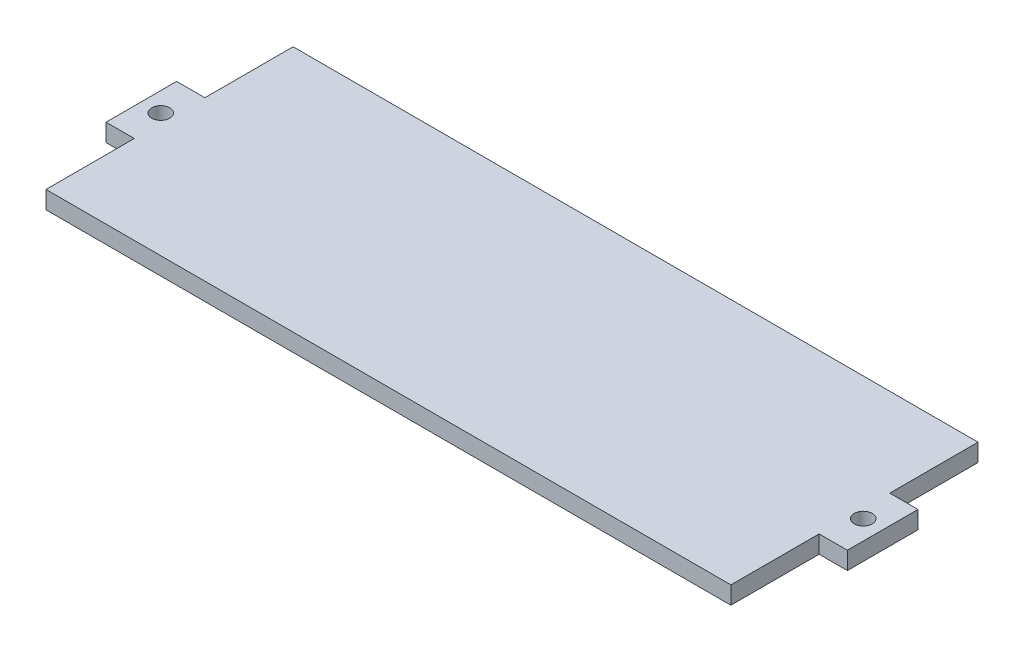
ISO-10303-21;
HEADER;
FILE_DESCRIPTION(('STEP AP214'),'2;1');
FILE_NAME('part.step','',(''),(''),'','','');
FILE_SCHEMA(('AUTOMOTIVE_DESIGN { 1 0 10303 214 1 1 1 1 }'));
ENDSEC;
DATA;
#1=APPLICATION_CONTEXT('core data for automotive mechanical design processes');
#2=APPLICATION_PROTOCOL_DEFINITION('international standard','automotive_design',2000,#1);
#3=PRODUCT_CONTEXT('',#1,'mechanical');
#4=PRODUCT('Part','Part','',(#3));
#5=PRODUCT_RELATED_PRODUCT_CATEGORY('part','',(#4));
#6=PRODUCT_DEFINITION_FORMATION('','',#4);
#7=PRODUCT_DEFINITION_CONTEXT('part definition',#1,'design');
#8=PRODUCT_DEFINITION('design','',#6,#7);
#9=PRODUCT_DEFINITION_SHAPE('','',#8);
#10=(LENGTH_UNIT() NAMED_UNIT(*) SI_UNIT(.MILLI.,.METRE.));
#11=(NAMED_UNIT(*) PLANE_ANGLE_UNIT() SI_UNIT($,.RADIAN.));
#12=(NAMED_UNIT(*) SI_UNIT($,.STERADIAN.) SOLID_ANGLE_UNIT());
#13=UNCERTAINTY_MEASURE_WITH_UNIT(LENGTH_MEASURE(1.E-05),#10,'distance_accuracy_value','');
#14=(GEOMETRIC_REPRESENTATION_CONTEXT(3) GLOBAL_UNCERTAINTY_ASSIGNED_CONTEXT((#13)) GLOBAL_UNIT_ASSIGNED_CONTEXT((#10,
#11,#12)) REPRESENTATION_CONTEXT('',''));
#15=CARTESIAN_POINT('',(0.,0.,0.));
#16=DIRECTION('',(0.,0.,1.));
#17=DIRECTION('',(1.,0.,0.));
#18=AXIS2_PLACEMENT_3D('',#15,#16,#17);
#19=CARTESIAN_POINT('',(0.,3.175,0.));
#20=DIRECTION('',(0.,1.,0.));
#21=DIRECTION('',(0.,0.,1.));
#22=AXIS2_PLACEMENT_3D('',#19,#20,#21);
#23=PLANE('',#22);
#24=CARTESIAN_POINT('',(-1.5875,3.175,-22.225));
#25=DIRECTION('',(0.,1.,0.));
#26=DIRECTION('',(0.,0.,1.));
#27=AXIS2_PLACEMENT_3D('',#24,#25,#26);
#28=CIRCLE('',#27,1.6256);
#29=CARTESIAN_POINT('',(-1.5875,3.175,-20.5994));
#30=VERTEX_POINT('',#29);
#31=EDGE_CURVE('E157',#30,#30,#28,.T.);
#32=ORIENTED_EDGE('',*,*,#31,.F.);
#33=EDGE_LOOP('',(#32));
#34=FACE_BOUND('',#33,.T.);
#35=DIRECTION('',(0.,0.,1.));
#36=VECTOR('',#35,1.);
#37=CARTESIAN_POINT('',(0.,3.175,0.));
#38=LINE('',#37,#36);
#39=CARTESIAN_POINT('',(0.,3.175,-15.875));
#40=VERTEX_POINT('',#39);
#41=CARTESIAN_POINT('',(0.,3.175,0.));
#42=VERTEX_POINT('',#41);
#43=EDGE_CURVE('E176',#40,#42,#38,.T.);
#44=ORIENTED_EDGE('',*,*,#43,.T.);
#45=DIRECTION('',(1.,0.,0.));
#46=VECTOR('',#45,1.);
#47=CARTESIAN_POINT('',(0.,3.175,0.));
#48=LINE('',#47,#46);
#49=CARTESIAN_POINT('',(123.19,3.175,0.));
#50=VERTEX_POINT('',#49);
#51=EDGE_CURVE('E104',#42,#50,#48,.T.);
#52=ORIENTED_EDGE('',*,*,#51,.T.);
#53=DIRECTION('',(0.,0.,-1.));
#54=VECTOR('',#53,1.);
#55=CARTESIAN_POINT('',(123.19,3.175,0.));
#56=LINE('',#55,#54);
#57=CARTESIAN_POINT('',(123.19,3.175,-15.875));
#58=VERTEX_POINT('',#57);
#59=EDGE_CURVE('E203',#50,#58,#56,.T.);
#60=ORIENTED_EDGE('',*,*,#59,.T.);
#61=DIRECTION('',(1.,0.,0.));
#62=VECTOR('',#61,1.);
#63=CARTESIAN_POINT('',(123.19,3.175,-15.875));
#64=LINE('',#63,#62);
#65=CARTESIAN_POINT('',(128.27,3.175,-15.875));
#66=VERTEX_POINT('',#65);
#67=EDGE_CURVE('E222',#58,#66,#64,.T.);
#68=ORIENTED_EDGE('',*,*,#67,.T.);
#69=DIRECTION('',(0.,0.,-1.));
#70=VECTOR('',#69,1.);
#71=CARTESIAN_POINT('',(128.27,3.175,-28.575));
#72=LINE('',#71,#70);
#73=CARTESIAN_POINT('',(128.27,3.175,-28.575));
#74=VERTEX_POINT('',#73);
#75=EDGE_CURVE('E219',#66,#74,#72,.T.);
#76=ORIENTED_EDGE('',*,*,#75,.T.);
#77=DIRECTION('',(-1.,0.,0.));
#78=VECTOR('',#77,1.);
#79=CARTESIAN_POINT('',(123.19,3.175,-28.575));
#80=LINE('',#79,#78);
#81=CARTESIAN_POINT('',(123.19,3.175,-28.575));
#82=VERTEX_POINT('',#81);
#83=EDGE_CURVE('E221',#74,#82,#80,.T.);
#84=ORIENTED_EDGE('',*,*,#83,.T.);
#85=DIRECTION('',(0.,0.,-1.));
#86=VECTOR('',#85,1.);
#87=CARTESIAN_POINT('',(123.19,3.175,-28.575));
#88=LINE('',#87,#86);
#89=CARTESIAN_POINT('',(123.19,3.175,-44.45));
#90=VERTEX_POINT('',#89);
#91=EDGE_CURVE('E224',#82,#90,#88,.T.);
#92=ORIENTED_EDGE('',*,*,#91,.T.);
#93=DIRECTION('',(-1.,0.,0.));
#94=VECTOR('',#93,1.);
#95=CARTESIAN_POINT('',(0.,3.175,-44.45));
#96=LINE('',#95,#94);
#97=CARTESIAN_POINT('',(0.,3.175,-44.45));
#98=VERTEX_POINT('',#97);
#99=EDGE_CURVE('E230',#90,#98,#96,.T.);
#100=ORIENTED_EDGE('',*,*,#99,.T.);
#101=DIRECTION('',(0.,0.,1.));
#102=VECTOR('',#101,1.);
#103=CARTESIAN_POINT('',(0.,3.175,-28.575));
#104=LINE('',#103,#102);
#105=CARTESIAN_POINT('',(0.,3.175,-28.575));
#106=VERTEX_POINT('',#105);
#107=EDGE_CURVE('E135',#98,#106,#104,.T.);
#108=ORIENTED_EDGE('',*,*,#107,.T.);
#109=DIRECTION('',(-1.,0.,0.));
#110=VECTOR('',#109,1.);
#111=CARTESIAN_POINT('',(0.,3.175,-28.575));
#112=LINE('',#111,#110);
#113=CARTESIAN_POINT('',(-5.08,3.175,-28.575));
#114=VERTEX_POINT('',#113);
#115=EDGE_CURVE('E129',#106,#114,#112,.T.);
#116=ORIENTED_EDGE('',*,*,#115,.T.);
#117=DIRECTION('',(0.,0.,1.));
#118=VECTOR('',#117,1.);
#119=CARTESIAN_POINT('',(-5.08,3.175,-28.575));
#120=LINE('',#119,#118);
#121=CARTESIAN_POINT('',(-5.08,3.175,-15.875));
#122=VERTEX_POINT('',#121);
#123=EDGE_CURVE('E133',#114,#122,#120,.T.);
#124=ORIENTED_EDGE('',*,*,#123,.T.);
#125=DIRECTION('',(1.,0.,0.));
#126=VECTOR('',#125,1.);
#127=CARTESIAN_POINT('',(0.,3.175,-15.875));
#128=LINE('',#127,#126);
#129=EDGE_CURVE('E49',#122,#40,#128,.T.);
#130=ORIENTED_EDGE('',*,*,#129,.T.);
#131=EDGE_LOOP('',(#44,#52,#60,#68,#76,#84,#92,#100,#108,#116,#124,#130));
#132=FACE_BOUND('',#131,.T.);
#133=CARTESIAN_POINT('',(124.7775,3.175,-22.225));
#134=DIRECTION('',(0.,1.,0.));
#135=DIRECTION('',(0.,0.,1.));
#136=AXIS2_PLACEMENT_3D('',#133,#134,#135);
#137=CIRCLE('',#136,1.62560000000003);
#138=CARTESIAN_POINT('',(124.7775,3.175,-20.5994));
#139=VERTEX_POINT('',#138);
#140=EDGE_CURVE('E273',#139,#139,#137,.T.);
#141=ORIENTED_EDGE('',*,*,#140,.F.);
#142=EDGE_LOOP('',(#141));
#143=FACE_BOUND('',#142,.T.);
#144=ADVANCED_FACE('F32',(#34,#132,#143),#23,.T.);
#145=CARTESIAN_POINT('',(0.,0.,0.));
#146=DIRECTION('',(0.,1.,0.));
#147=DIRECTION('',(0.,0.,1.));
#148=AXIS2_PLACEMENT_3D('',#145,#146,#147);
#149=PLANE('',#148);
#150=CARTESIAN_POINT('',(-1.5875,0.,-22.225));
#151=DIRECTION('',(0.,1.,0.));
#152=DIRECTION('',(0.,0.,1.));
#153=AXIS2_PLACEMENT_3D('',#150,#151,#152);
#154=CIRCLE('',#153,1.6256);
#155=CARTESIAN_POINT('',(-1.5875,0.,-20.5994));
#156=VERTEX_POINT('',#155);
#157=EDGE_CURVE('E278',#156,#156,#154,.T.);
#158=ORIENTED_EDGE('',*,*,#157,.T.);
#159=EDGE_LOOP('',(#158));
#160=FACE_BOUND('',#159,.T.);
#161=DIRECTION('',(0.,0.,1.));
#162=VECTOR('',#161,1.);
#163=CARTESIAN_POINT('',(0.,0.,0.));
#164=LINE('',#163,#162);
#165=CARTESIAN_POINT('',(0.,0.,-15.875));
#166=VERTEX_POINT('',#165);
#167=CARTESIAN_POINT('',(0.,0.,0.));
#168=VERTEX_POINT('',#167);
#169=EDGE_CURVE('E153',#166,#168,#164,.T.);
#170=ORIENTED_EDGE('',*,*,#169,.F.);
#171=DIRECTION('',(1.,0.,0.));
#172=VECTOR('',#171,1.);
#173=CARTESIAN_POINT('',(0.,0.,-15.875));
#174=LINE('',#173,#172);
#175=CARTESIAN_POINT('',(-5.08,0.,-15.875));
#176=VERTEX_POINT('',#175);
#177=EDGE_CURVE('E96',#176,#166,#174,.T.);
#178=ORIENTED_EDGE('',*,*,#177,.F.);
#179=DIRECTION('',(0.,0.,1.));
#180=VECTOR('',#179,1.);
#181=CARTESIAN_POINT('',(-5.08,0.,-28.575));
#182=LINE('',#181,#180);
#183=CARTESIAN_POINT('',(-5.08,0.,-28.575));
#184=VERTEX_POINT('',#183);
#185=EDGE_CURVE('E90',#184,#176,#182,.T.);
#186=ORIENTED_EDGE('',*,*,#185,.F.);
#187=DIRECTION('',(-1.,0.,0.));
#188=VECTOR('',#187,1.);
#189=CARTESIAN_POINT('',(0.,0.,-28.575));
#190=LINE('',#189,#188);
#191=CARTESIAN_POINT('',(0.,0.,-28.575));
#192=VERTEX_POINT('',#191);
#193=EDGE_CURVE('E143',#192,#184,#190,.T.);
#194=ORIENTED_EDGE('',*,*,#193,.F.);
#195=DIRECTION('',(0.,0.,1.));
#196=VECTOR('',#195,1.);
#197=CARTESIAN_POINT('',(0.,0.,-28.575));
#198=LINE('',#197,#196);
#199=CARTESIAN_POINT('',(0.,0.,-44.45));
#200=VERTEX_POINT('',#199);
#201=EDGE_CURVE('E171',#200,#192,#198,.T.);
#202=ORIENTED_EDGE('',*,*,#201,.F.);
#203=DIRECTION('',(-1.,0.,0.));
#204=VECTOR('',#203,1.);
#205=CARTESIAN_POINT('',(0.,0.,-44.45));
#206=LINE('',#205,#204);
#207=CARTESIAN_POINT('',(123.19,0.,-44.45));
#208=VERTEX_POINT('',#207);
#209=EDGE_CURVE('E169',#208,#200,#206,.T.);
#210=ORIENTED_EDGE('',*,*,#209,.F.);
#211=DIRECTION('',(0.,0.,-1.));
#212=VECTOR('',#211,1.);
#213=CARTESIAN_POINT('',(123.19,0.,-28.575));
#214=LINE('',#213,#212);
#215=CARTESIAN_POINT('',(123.19,0.,-28.575));
#216=VERTEX_POINT('',#215);
#217=EDGE_CURVE('E167',#216,#208,#214,.T.);
#218=ORIENTED_EDGE('',*,*,#217,.F.);
#219=DIRECTION('',(-1.,0.,0.));
#220=VECTOR('',#219,1.);
#221=CARTESIAN_POINT('',(123.19,0.,-28.575));
#222=LINE('',#221,#220);
#223=CARTESIAN_POINT('',(128.27,0.,-28.575));
#224=VERTEX_POINT('',#223);
#225=EDGE_CURVE('E165',#224,#216,#222,.T.);
#226=ORIENTED_EDGE('',*,*,#225,.F.);
#227=DIRECTION('',(0.,0.,-1.));
#228=VECTOR('',#227,1.);
#229=CARTESIAN_POINT('',(128.27,0.,-28.575));
#230=LINE('',#229,#228);
#231=CARTESIAN_POINT('',(128.27,0.,-15.875));
#232=VERTEX_POINT('',#231);
#233=EDGE_CURVE('E163',#232,#224,#230,.T.);
#234=ORIENTED_EDGE('',*,*,#233,.F.);
#235=DIRECTION('',(1.,0.,0.));
#236=VECTOR('',#235,1.);
#237=CARTESIAN_POINT('',(123.19,0.,-15.875));
#238=LINE('',#237,#236);
#239=CARTESIAN_POINT('',(123.19,0.,-15.875));
#240=VERTEX_POINT('',#239);
#241=EDGE_CURVE('E161',#240,#232,#238,.T.);
#242=ORIENTED_EDGE('',*,*,#241,.F.);
#243=DIRECTION('',(0.,0.,-1.));
#244=VECTOR('',#243,1.);
#245=CARTESIAN_POINT('',(123.19,0.,0.));
#246=LINE('',#245,#244);
#247=CARTESIAN_POINT('',(123.19,0.,0.));
#248=VERTEX_POINT('',#247);
#249=EDGE_CURVE('E159',#248,#240,#246,.T.);
#250=ORIENTED_EDGE('',*,*,#249,.F.);
#251=DIRECTION('',(1.,0.,0.));
#252=VECTOR('',#251,1.);
#253=CARTESIAN_POINT('',(0.,0.,0.));
#254=LINE('',#253,#252);
#255=EDGE_CURVE('E156',#168,#248,#254,.T.);
#256=ORIENTED_EDGE('',*,*,#255,.F.);
#257=EDGE_LOOP('',(#170,#178,#186,#194,#202,#210,#218,#226,#234,#242,#250,#256));
#258=FACE_BOUND('',#257,.T.);
#259=CARTESIAN_POINT('',(124.7775,0.,-22.225));
#260=DIRECTION('',(0.,1.,0.));
#261=DIRECTION('',(0.,0.,1.));
#262=AXIS2_PLACEMENT_3D('',#259,#260,#261);
#263=CIRCLE('',#262,1.62560000000003);
#264=CARTESIAN_POINT('',(124.7775,0.,-20.5994));
#265=VERTEX_POINT('',#264);
#266=EDGE_CURVE('E276',#265,#265,#263,.T.);
#267=ORIENTED_EDGE('',*,*,#266,.T.);
#268=EDGE_LOOP('',(#267));
#269=FACE_BOUND('',#268,.T.);
#270=ADVANCED_FACE('F207',(#160,#258,#269),#149,.F.);
#271=CARTESIAN_POINT('',(0.,3.175,0.));
#272=DIRECTION('',(1.,0.,0.));
#273=DIRECTION('',(0.,0.,-1.));
#274=AXIS2_PLACEMENT_3D('',#271,#272,#273);
#275=PLANE('',#274);
#276=ORIENTED_EDGE('',*,*,#169,.T.);
#277=DIRECTION('',(0.,-1.,0.));
#278=VECTOR('',#277,1.);
#279=CARTESIAN_POINT('',(0.,3.175,0.));
#280=LINE('',#279,#278);
#281=EDGE_CURVE('E11',#42,#168,#280,.T.);
#282=ORIENTED_EDGE('',*,*,#281,.F.);
#283=ORIENTED_EDGE('',*,*,#43,.F.);
#284=DIRECTION('',(0.,-1.,0.));
#285=VECTOR('',#284,1.);
#286=CARTESIAN_POINT('',(0.,3.175,-15.875));
#287=LINE('',#286,#285);
#288=EDGE_CURVE('E149',#40,#166,#287,.T.);
#289=ORIENTED_EDGE('',*,*,#288,.T.);
#290=EDGE_LOOP('',(#276,#282,#283,#289));
#291=FACE_BOUND('',#290,.T.);
#292=ADVANCED_FACE('F34',(#291),#275,.F.);
#293=CARTESIAN_POINT('',(0.,3.175,0.));
#294=DIRECTION('',(0.,0.,-1.));
#295=DIRECTION('',(-1.,0.,0.));
#296=AXIS2_PLACEMENT_3D('',#293,#294,#295);
#297=PLANE('',#296);
#298=ORIENTED_EDGE('',*,*,#255,.T.);
#299=DIRECTION('',(0.,-1.,0.));
#300=VECTOR('',#299,1.);
#301=CARTESIAN_POINT('',(123.19,3.175,0.));
#302=LINE('',#301,#300);
#303=EDGE_CURVE('E41',#50,#248,#302,.T.);
#304=ORIENTED_EDGE('',*,*,#303,.F.);
#305=ORIENTED_EDGE('',*,*,#51,.F.);
#306=ORIENTED_EDGE('',*,*,#281,.T.);
#307=EDGE_LOOP('',(#298,#304,#305,#306));
#308=FACE_BOUND('',#307,.T.);
#309=ADVANCED_FACE('F371',(#308),#297,.F.);
#310=CARTESIAN_POINT('',(123.19,3.175,0.));
#311=DIRECTION('',(-1.,0.,0.));
#312=DIRECTION('',(0.,0.,1.));
#313=AXIS2_PLACEMENT_3D('',#310,#311,#312);
#314=PLANE('',#313);
#315=ORIENTED_EDGE('',*,*,#249,.T.);
#316=DIRECTION('',(0.,-1.,0.));
#317=VECTOR('',#316,1.);
#318=CARTESIAN_POINT('',(123.19,3.175,-15.875));
#319=LINE('',#318,#317);
#320=EDGE_CURVE('E195',#58,#240,#319,.T.);
#321=ORIENTED_EDGE('',*,*,#320,.F.);
#322=ORIENTED_EDGE('',*,*,#59,.F.);
#323=ORIENTED_EDGE('',*,*,#303,.T.);
#324=EDGE_LOOP('',(#315,#321,#322,#323));
#325=FACE_BOUND('',#324,.T.);
#326=ADVANCED_FACE('F201',(#325),#314,.F.);
#327=CARTESIAN_POINT('',(123.19,3.175,-15.875));
#328=DIRECTION('',(0.,0.,-1.));
#329=DIRECTION('',(-1.,0.,0.));
#330=AXIS2_PLACEMENT_3D('',#327,#328,#329);
#331=PLANE('',#330);
#332=ORIENTED_EDGE('',*,*,#241,.T.);
#333=DIRECTION('',(0.,-1.,0.));
#334=VECTOR('',#333,1.);
#335=CARTESIAN_POINT('',(128.27,3.175,-15.875));
#336=LINE('',#335,#334);
#337=EDGE_CURVE('E192',#66,#232,#336,.T.);
#338=ORIENTED_EDGE('',*,*,#337,.F.);
#339=ORIENTED_EDGE('',*,*,#67,.F.);
#340=ORIENTED_EDGE('',*,*,#320,.T.);
#341=EDGE_LOOP('',(#332,#338,#339,#340));
#342=FACE_BOUND('',#341,.T.);
#343=ADVANCED_FACE('F213',(#342),#331,.F.);
#344=CARTESIAN_POINT('',(128.27,3.175,-28.575));
#345=DIRECTION('',(-1.,0.,0.));
#346=DIRECTION('',(0.,0.,1.));
#347=AXIS2_PLACEMENT_3D('',#344,#345,#346);
#348=PLANE('',#347);
#349=ORIENTED_EDGE('',*,*,#233,.T.);
#350=DIRECTION('',(0.,-1.,0.));
#351=VECTOR('',#350,1.);
#352=CARTESIAN_POINT('',(128.27,3.175,-28.575));
#353=LINE('',#352,#351);
#354=EDGE_CURVE('E189',#74,#224,#353,.T.);
#355=ORIENTED_EDGE('',*,*,#354,.F.);
#356=ORIENTED_EDGE('',*,*,#75,.F.);
#357=ORIENTED_EDGE('',*,*,#337,.T.);
#358=EDGE_LOOP('',(#349,#355,#356,#357));
#359=FACE_BOUND('',#358,.T.);
#360=ADVANCED_FACE('F217',(#359),#348,.F.);
#361=CARTESIAN_POINT('',(123.19,3.175,-28.575));
#362=DIRECTION('',(0.,0.,1.));
#363=DIRECTION('',(1.,0.,0.));
#364=AXIS2_PLACEMENT_3D('',#361,#362,#363);
#365=PLANE('',#364);
#366=ORIENTED_EDGE('',*,*,#225,.T.);
#367=DIRECTION('',(0.,-1.,0.));
#368=VECTOR('',#367,1.);
#369=CARTESIAN_POINT('',(123.19,3.175,-28.575));
#370=LINE('',#369,#368);
#371=EDGE_CURVE('E186',#82,#216,#370,.T.);
#372=ORIENTED_EDGE('',*,*,#371,.F.);
#373=ORIENTED_EDGE('',*,*,#83,.F.);
#374=ORIENTED_EDGE('',*,*,#354,.T.);
#375=EDGE_LOOP('',(#366,#372,#373,#374));
#376=FACE_BOUND('',#375,.T.);
#377=ADVANCED_FACE('F336',(#376),#365,.F.);
#378=CARTESIAN_POINT('',(123.19,3.175,-28.575));
#379=DIRECTION('',(-1.,0.,0.));
#380=DIRECTION('',(0.,0.,1.));
#381=AXIS2_PLACEMENT_3D('',#378,#379,#380);
#382=PLANE('',#381);
#383=ORIENTED_EDGE('',*,*,#217,.T.);
#384=DIRECTION('',(0.,-1.,0.));
#385=VECTOR('',#384,1.);
#386=CARTESIAN_POINT('',(123.19,3.175,-44.45));
#387=LINE('',#386,#385);
#388=EDGE_CURVE('E183',#90,#208,#387,.T.);
#389=ORIENTED_EDGE('',*,*,#388,.F.);
#390=ORIENTED_EDGE('',*,*,#91,.F.);
#391=ORIENTED_EDGE('',*,*,#371,.T.);
#392=EDGE_LOOP('',(#383,#389,#390,#391));
#393=FACE_BOUND('',#392,.T.);
#394=ADVANCED_FACE('F327',(#393),#382,.F.);
#395=CARTESIAN_POINT('',(0.,3.175,-44.45));
#396=DIRECTION('',(0.,0.,1.));
#397=DIRECTION('',(1.,0.,0.));
#398=AXIS2_PLACEMENT_3D('',#395,#396,#397);
#399=PLANE('',#398);
#400=ORIENTED_EDGE('',*,*,#209,.T.);
#401=DIRECTION('',(0.,-1.,0.));
#402=VECTOR('',#401,1.);
#403=CARTESIAN_POINT('',(0.,3.175,-44.45));
#404=LINE('',#403,#402);
#405=EDGE_CURVE('E180',#98,#200,#404,.T.);
#406=ORIENTED_EDGE('',*,*,#405,.F.);
#407=ORIENTED_EDGE('',*,*,#99,.F.);
#408=ORIENTED_EDGE('',*,*,#388,.T.);
#409=EDGE_LOOP('',(#400,#406,#407,#408));
#410=FACE_BOUND('',#409,.T.);
#411=ADVANCED_FACE('F236',(#410),#399,.F.);
#412=CARTESIAN_POINT('',(0.,3.175,-28.575));
#413=DIRECTION('',(1.,0.,0.));
#414=DIRECTION('',(0.,0.,-1.));
#415=AXIS2_PLACEMENT_3D('',#412,#413,#414);
#416=PLANE('',#415);
#417=ORIENTED_EDGE('',*,*,#201,.T.);
#418=DIRECTION('',(0.,-1.,0.));
#419=VECTOR('',#418,1.);
#420=CARTESIAN_POINT('',(0.,3.175,-28.575));
#421=LINE('',#420,#419);
#422=EDGE_CURVE('E144',#106,#192,#421,.T.);
#423=ORIENTED_EDGE('',*,*,#422,.F.);
#424=ORIENTED_EDGE('',*,*,#107,.F.);
#425=ORIENTED_EDGE('',*,*,#405,.T.);
#426=EDGE_LOOP('',(#417,#423,#424,#425));
#427=FACE_BOUND('',#426,.T.);
#428=ADVANCED_FACE('F240',(#427),#416,.F.);
#429=CARTESIAN_POINT('',(0.,3.175,-28.575));
#430=DIRECTION('',(0.,0.,1.));
#431=DIRECTION('',(1.,0.,0.));
#432=AXIS2_PLACEMENT_3D('',#429,#430,#431);
#433=PLANE('',#432);
#434=ORIENTED_EDGE('',*,*,#193,.T.);
#435=DIRECTION('',(0.,-1.,0.));
#436=VECTOR('',#435,1.);
#437=CARTESIAN_POINT('',(-5.08,3.175,-28.575));
#438=LINE('',#437,#436);
#439=EDGE_CURVE('E140',#114,#184,#438,.T.);
#440=ORIENTED_EDGE('',*,*,#439,.F.);
#441=ORIENTED_EDGE('',*,*,#115,.F.);
#442=ORIENTED_EDGE('',*,*,#422,.T.);
#443=EDGE_LOOP('',(#434,#440,#441,#442));
#444=FACE_BOUND('',#443,.T.);
#445=ADVANCED_FACE('F141',(#444),#433,.F.);
#446=CARTESIAN_POINT('',(-5.08,3.175,-28.575));
#447=DIRECTION('',(1.,0.,0.));
#448=DIRECTION('',(0.,0.,-1.));
#449=AXIS2_PLACEMENT_3D('',#446,#447,#448);
#450=PLANE('',#449);
#451=ORIENTED_EDGE('',*,*,#185,.T.);
#452=DIRECTION('',(0.,-1.,0.));
#453=VECTOR('',#452,1.);
#454=CARTESIAN_POINT('',(-5.08,3.175,-15.875));
#455=LINE('',#454,#453);
#456=EDGE_CURVE('E145',#122,#176,#455,.T.);
#457=ORIENTED_EDGE('',*,*,#456,.F.);
#458=ORIENTED_EDGE('',*,*,#123,.F.);
#459=ORIENTED_EDGE('',*,*,#439,.T.);
#460=EDGE_LOOP('',(#451,#457,#458,#459));
#461=FACE_BOUND('',#460,.T.);
#462=ADVANCED_FACE('F147',(#461),#450,.F.);
#463=CARTESIAN_POINT('',(0.,3.175,-15.875));
#464=DIRECTION('',(0.,0.,-1.));
#465=DIRECTION('',(-1.,0.,0.));
#466=AXIS2_PLACEMENT_3D('',#463,#464,#465);
#467=PLANE('',#466);
#468=ORIENTED_EDGE('',*,*,#177,.T.);
#469=ORIENTED_EDGE('',*,*,#288,.F.);
#470=ORIENTED_EDGE('',*,*,#129,.F.);
#471=ORIENTED_EDGE('',*,*,#456,.T.);
#472=EDGE_LOOP('',(#468,#469,#470,#471));
#473=FACE_BOUND('',#472,.T.);
#474=ADVANCED_FACE('F244',(#473),#467,.F.);
#475=CARTESIAN_POINT('',(-1.5875,3.175,-22.225));
#476=DIRECTION('',(0.,-1.,0.));
#477=DIRECTION('',(0.,0.,-1.));
#478=AXIS2_PLACEMENT_3D('',#475,#476,#477);
#479=CYLINDRICAL_SURFACE('',#478,1.6256);
#480=ORIENTED_EDGE('',*,*,#31,.T.);
#481=EDGE_LOOP('',(#480));
#482=FACE_BOUND('',#481,.T.);
#483=ORIENTED_EDGE('',*,*,#157,.F.);
#484=EDGE_LOOP('',(#483));
#485=FACE_BOUND('',#484,.T.);
#486=ADVANCED_FACE('F246',(#482,#485),#479,.F.);
#487=CARTESIAN_POINT('',(124.7775,3.175,-22.225));
#488=DIRECTION('',(0.,-1.,0.));
#489=DIRECTION('',(0.,0.,-1.));
#490=AXIS2_PLACEMENT_3D('',#487,#488,#489);
#491=CYLINDRICAL_SURFACE('',#490,1.62560000000003);
#492=ORIENTED_EDGE('',*,*,#140,.T.);
#493=EDGE_LOOP('',(#492));
#494=FACE_BOUND('',#493,.T.);
#495=ORIENTED_EDGE('',*,*,#266,.F.);
#496=EDGE_LOOP('',(#495));
#497=FACE_BOUND('',#496,.T.);
#498=ADVANCED_FACE('F252',(#494,#497),#491,.F.);
#499=CLOSED_SHELL('',(#144,#270,#292,#309,#326,#343,#360,#377,#394,#411,#428,#445,#462,#474,
#486,#498));
#500=MANIFOLD_SOLID_BREP('B2',#499);
#501=ADVANCED_BREP_SHAPE_REPRESENTATION('',(#18,#500),#14);
#502=SHAPE_DEFINITION_REPRESENTATION(#9,#501);
ENDSEC;
END-ISO-10303-21;
